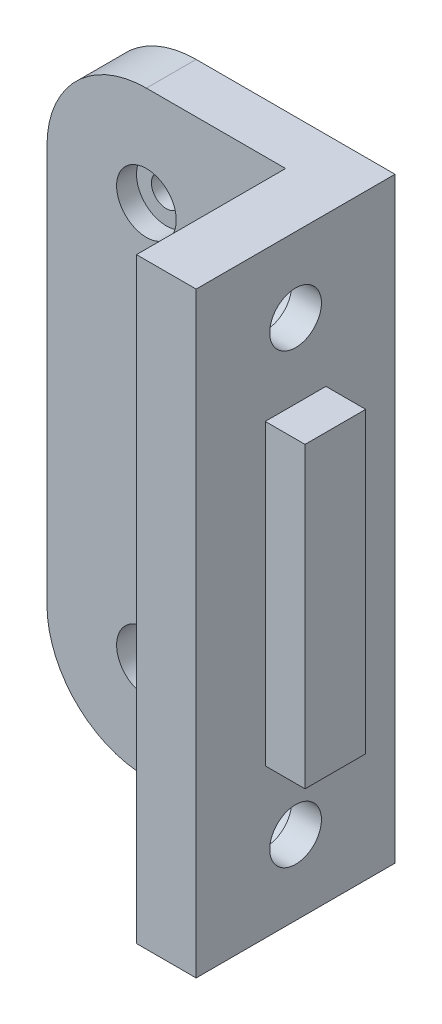
ISO-10303-21;
HEADER;
FILE_DESCRIPTION(('STEP AP214'),'2;1');
FILE_NAME('part.step','',(''),(''),'','','');
FILE_SCHEMA(('AUTOMOTIVE_DESIGN { 1 0 10303 214 1 1 1 1 }'));
ENDSEC;
DATA;
#1=APPLICATION_CONTEXT('core data for automotive mechanical design processes');
#2=APPLICATION_PROTOCOL_DEFINITION('international standard','automotive_design',2000,#1);
#3=PRODUCT_CONTEXT('',#1,'mechanical');
#4=PRODUCT('Part','Part','',(#3));
#5=PRODUCT_RELATED_PRODUCT_CATEGORY('part','',(#4));
#6=PRODUCT_DEFINITION_FORMATION('','',#4);
#7=PRODUCT_DEFINITION_CONTEXT('part definition',#1,'design');
#8=PRODUCT_DEFINITION('design','',#6,#7);
#9=PRODUCT_DEFINITION_SHAPE('','',#8);
#10=(LENGTH_UNIT() NAMED_UNIT(*) SI_UNIT(.MILLI.,.METRE.));
#11=(NAMED_UNIT(*) PLANE_ANGLE_UNIT() SI_UNIT($,.RADIAN.));
#12=(NAMED_UNIT(*) SI_UNIT($,.STERADIAN.) SOLID_ANGLE_UNIT());
#13=UNCERTAINTY_MEASURE_WITH_UNIT(LENGTH_MEASURE(1.E-05),#10,'distance_accuracy_value','');
#14=(GEOMETRIC_REPRESENTATION_CONTEXT(3) GLOBAL_UNCERTAINTY_ASSIGNED_CONTEXT((#13)) GLOBAL_UNIT_ASSIGNED_CONTEXT((#10,
#11,#12)) REPRESENTATION_CONTEXT('',''));
#15=CARTESIAN_POINT('',(0.,0.,0.));
#16=DIRECTION('',(0.,0.,1.));
#17=DIRECTION('',(1.,0.,0.));
#18=AXIS2_PLACEMENT_3D('',#15,#16,#17);
#19=CARTESIAN_POINT('',(0.,25.,0.));
#20=DIRECTION('',(0.,0.,1.));
#21=DIRECTION('',(1.,0.,0.));
#22=AXIS2_PLACEMENT_3D('',#19,#20,#21);
#23=CYLINDRICAL_SURFACE('',#22,1.5);
#24=CARTESIAN_POINT('',(0.,25.,0.));
#25=DIRECTION('',(0.,0.,1.));
#26=DIRECTION('',(1.,0.,0.));
#27=AXIS2_PLACEMENT_3D('',#24,#25,#26);
#28=CIRCLE('',#27,1.5);
#29=CARTESIAN_POINT('',(1.5,25.,0.));
#30=VERTEX_POINT('',#29);
#31=EDGE_CURVE('E232',#30,#30,#28,.T.);
#32=ORIENTED_EDGE('',*,*,#31,.F.);
#33=EDGE_LOOP('',(#32));
#34=FACE_BOUND('',#33,.T.);
#35=CARTESIAN_POINT('',(0.,25.,3.));
#36=DIRECTION('',(0.,0.,1.));
#37=DIRECTION('',(1.,0.,0.));
#38=AXIS2_PLACEMENT_3D('',#35,#36,#37);
#39=CIRCLE('',#38,1.5);
#40=CARTESIAN_POINT('',(1.5,25.,3.));
#41=VERTEX_POINT('',#40);
#42=EDGE_CURVE('E44',#41,#41,#39,.F.);
#43=ORIENTED_EDGE('',*,*,#42,.F.);
#44=EDGE_LOOP('',(#43));
#45=FACE_BOUND('',#44,.T.);
#46=ADVANCED_FACE('F40',(#34,#45),#23,.F.);
#47=CARTESIAN_POINT('',(10.,65.,0.));
#48=DIRECTION('',(0.,0.,1.));
#49=DIRECTION('',(1.,0.,0.));
#50=AXIS2_PLACEMENT_3D('',#47,#48,#49);
#51=CYLINDRICAL_SURFACE('',#50,1.5);
#52=CARTESIAN_POINT('',(10.,65.,0.));
#53=DIRECTION('',(0.,0.,1.));
#54=DIRECTION('',(1.,0.,0.));
#55=AXIS2_PLACEMENT_3D('',#52,#53,#54);
#56=CIRCLE('',#55,1.5);
#57=CARTESIAN_POINT('',(11.5,65.,0.));
#58=VERTEX_POINT('',#57);
#59=EDGE_CURVE('E223',#58,#58,#56,.T.);
#60=ORIENTED_EDGE('',*,*,#59,.F.);
#61=EDGE_LOOP('',(#60));
#62=FACE_BOUND('',#61,.T.);
#63=CARTESIAN_POINT('',(10.,65.,3.));
#64=DIRECTION('',(0.,0.,1.));
#65=DIRECTION('',(1.,0.,0.));
#66=AXIS2_PLACEMENT_3D('',#63,#64,#65);
#67=CIRCLE('',#66,1.5);
#68=CARTESIAN_POINT('',(11.5,65.,3.));
#69=VERTEX_POINT('',#68);
#70=EDGE_CURVE('E306',#69,#69,#67,.F.);
#71=ORIENTED_EDGE('',*,*,#70,.F.);
#72=EDGE_LOOP('',(#71));
#73=FACE_BOUND('',#72,.T.);
#74=ADVANCED_FACE('F354',(#62,#73),#51,.F.);
#75=CARTESIAN_POINT('',(0.,65.,0.));
#76=DIRECTION('',(0.,0.,1.));
#77=DIRECTION('',(1.,0.,0.));
#78=AXIS2_PLACEMENT_3D('',#75,#76,#77);
#79=CYLINDRICAL_SURFACE('',#78,1.5);
#80=CARTESIAN_POINT('',(0.,65.,0.));
#81=DIRECTION('',(0.,0.,1.));
#82=DIRECTION('',(1.,0.,0.));
#83=AXIS2_PLACEMENT_3D('',#80,#81,#82);
#84=CIRCLE('',#83,1.5);
#85=CARTESIAN_POINT('',(1.5,65.,0.));
#86=VERTEX_POINT('',#85);
#87=EDGE_CURVE('E227',#86,#86,#84,.T.);
#88=ORIENTED_EDGE('',*,*,#87,.F.);
#89=EDGE_LOOP('',(#88));
#90=FACE_BOUND('',#89,.T.);
#91=CARTESIAN_POINT('',(0.,65.,3.));
#92=DIRECTION('',(0.,0.,1.));
#93=DIRECTION('',(1.,0.,0.));
#94=AXIS2_PLACEMENT_3D('',#91,#92,#93);
#95=CIRCLE('',#94,1.5);
#96=CARTESIAN_POINT('',(1.5,65.,3.));
#97=VERTEX_POINT('',#96);
#98=EDGE_CURVE('E302',#97,#97,#95,.F.);
#99=ORIENTED_EDGE('',*,*,#98,.F.);
#100=EDGE_LOOP('',(#99));
#101=FACE_BOUND('',#100,.T.);
#102=ADVANCED_FACE('F347',(#90,#101),#79,.F.);
#103=CARTESIAN_POINT('',(10.,25.,0.));
#104=DIRECTION('',(0.,0.,1.));
#105=DIRECTION('',(1.,0.,0.));
#106=AXIS2_PLACEMENT_3D('',#103,#104,#105);
#107=CYLINDRICAL_SURFACE('',#106,1.5);
#108=CARTESIAN_POINT('',(10.,25.,0.));
#109=DIRECTION('',(0.,0.,1.));
#110=DIRECTION('',(1.,0.,0.));
#111=AXIS2_PLACEMENT_3D('',#108,#109,#110);
#112=CIRCLE('',#111,1.5);
#113=CARTESIAN_POINT('',(11.5,25.,0.));
#114=VERTEX_POINT('',#113);
#115=EDGE_CURVE('E228',#114,#114,#112,.T.);
#116=ORIENTED_EDGE('',*,*,#115,.F.);
#117=EDGE_LOOP('',(#116));
#118=FACE_BOUND('',#117,.T.);
#119=CARTESIAN_POINT('',(10.,25.,3.));
#120=DIRECTION('',(0.,0.,1.));
#121=DIRECTION('',(1.,0.,0.));
#122=AXIS2_PLACEMENT_3D('',#119,#120,#121);
#123=CIRCLE('',#122,1.5);
#124=CARTESIAN_POINT('',(11.5,25.,3.));
#125=VERTEX_POINT('',#124);
#126=EDGE_CURVE('E298',#125,#125,#123,.F.);
#127=ORIENTED_EDGE('',*,*,#126,.F.);
#128=EDGE_LOOP('',(#127));
#129=FACE_BOUND('',#128,.T.);
#130=ADVANCED_FACE('F338',(#118,#129),#107,.F.);
#131=CARTESIAN_POINT('',(20.,90.,0.));
#132=DIRECTION('',(-1.,0.,0.));
#133=DIRECTION('',(0.,0.,1.));
#134=AXIS2_PLACEMENT_3D('',#131,#132,#133);
#135=PLANE('',#134);
#136=DIRECTION('',(0.,-1.,0.));
#137=VECTOR('',#136,1.);
#138=CARTESIAN_POINT('',(20.,90.,0.));
#139=LINE('',#138,#137);
#140=CARTESIAN_POINT('',(20.,75.,0.));
#141=VERTEX_POINT('',#140);
#142=CARTESIAN_POINT('',(20.,15.,0.));
#143=VERTEX_POINT('',#142);
#144=EDGE_CURVE('E268',#141,#143,#139,.T.);
#145=ORIENTED_EDGE('',*,*,#144,.F.);
#146=DIRECTION('',(0.,0.,-1.));
#147=VECTOR('',#146,1.);
#148=CARTESIAN_POINT('',(20.,75.,40.));
#149=LINE('',#148,#147);
#150=CARTESIAN_POINT('',(20.,75.,20.));
#151=VERTEX_POINT('',#150);
#152=EDGE_CURVE('E194',#151,#141,#149,.T.);
#153=ORIENTED_EDGE('',*,*,#152,.F.);
#154=DIRECTION('',(0.,-1.,0.));
#155=VECTOR('',#154,1.);
#156=CARTESIAN_POINT('',(20.,90.,20.));
#157=LINE('',#156,#155);
#158=CARTESIAN_POINT('',(20.,15.,20.));
#159=VERTEX_POINT('',#158);
#160=EDGE_CURVE('E277',#151,#159,#157,.T.);
#161=ORIENTED_EDGE('',*,*,#160,.T.);
#162=DIRECTION('',(0.,0.,-1.));
#163=VECTOR('',#162,1.);
#164=CARTESIAN_POINT('',(20.,15.,40.));
#165=LINE('',#164,#163);
#166=EDGE_CURVE('E197',#159,#143,#165,.T.);
#167=ORIENTED_EDGE('',*,*,#166,.T.);
#168=EDGE_LOOP('',(#145,#153,#161,#167));
#169=FACE_BOUND('',#168,.T.);
#170=CARTESIAN_POINT('',(20.,22.5,10.));
#171=DIRECTION('',(1.,0.,0.));
#172=DIRECTION('',(0.,0.,-1.));
#173=AXIS2_PLACEMENT_3D('',#170,#171,#172);
#174=CIRCLE('',#173,2.6);
#175=CARTESIAN_POINT('',(20.,22.5,7.4));
#176=VERTEX_POINT('',#175);
#177=EDGE_CURVE('E260',#176,#176,#174,.T.);
#178=ORIENTED_EDGE('',*,*,#177,.F.);
#179=EDGE_LOOP('',(#178));
#180=FACE_BOUND('',#179,.T.);
#181=CARTESIAN_POINT('',(20.,67.5,10.));
#182=DIRECTION('',(1.,0.,0.));
#183=DIRECTION('',(0.,0.,-1.));
#184=AXIS2_PLACEMENT_3D('',#181,#182,#183);
#185=CIRCLE('',#184,2.6);
#186=CARTESIAN_POINT('',(20.,67.5,7.4));
#187=VERTEX_POINT('',#186);
#188=EDGE_CURVE('E255',#187,#187,#185,.T.);
#189=ORIENTED_EDGE('',*,*,#188,.F.);
#190=EDGE_LOOP('',(#189));
#191=FACE_BOUND('',#190,.T.);
#192=DIRECTION('',(0.,0.,-1.));
#193=VECTOR('',#192,1.);
#194=CARTESIAN_POINT('',(20.,30.,0.));
#195=LINE('',#194,#193);
#196=CARTESIAN_POINT('',(20.,30.,13.05));
#197=VERTEX_POINT('',#196);
#198=CARTESIAN_POINT('',(20.,30.,6.95));
#199=VERTEX_POINT('',#198);
#200=EDGE_CURVE('E162',#197,#199,#195,.T.);
#201=ORIENTED_EDGE('',*,*,#200,.F.);
#202=DIRECTION('',(0.,1.,0.));
#203=VECTOR('',#202,1.);
#204=CARTESIAN_POINT('',(20.,0.,13.05));
#205=LINE('',#204,#203);
#206=CARTESIAN_POINT('',(20.,60.,13.05));
#207=VERTEX_POINT('',#206);
#208=EDGE_CURVE('E158',#197,#207,#205,.T.);
#209=ORIENTED_EDGE('',*,*,#208,.T.);
#210=DIRECTION('',(0.,0.,-1.));
#211=VECTOR('',#210,1.);
#212=CARTESIAN_POINT('',(20.,60.,0.));
#213=LINE('',#212,#211);
#214=CARTESIAN_POINT('',(20.,60.,6.95));
#215=VERTEX_POINT('',#214);
#216=EDGE_CURVE('E58',#207,#215,#213,.T.);
#217=ORIENTED_EDGE('',*,*,#216,.T.);
#218=DIRECTION('',(0.,1.,0.));
#219=VECTOR('',#218,1.);
#220=CARTESIAN_POINT('',(20.,0.,6.95));
#221=LINE('',#220,#219);
#222=EDGE_CURVE('E316',#199,#215,#221,.T.);
#223=ORIENTED_EDGE('',*,*,#222,.F.);
#224=EDGE_LOOP('',(#201,#209,#217,#223));
#225=FACE_BOUND('',#224,.T.);
#226=ADVANCED_FACE('F335',(#169,#180,#191,#225),#135,.F.);
#227=CARTESIAN_POINT('',(5.,22.5,10.));
#228=DIRECTION('',(1.,0.,0.));
#229=DIRECTION('',(0.,0.,-1.));
#230=AXIS2_PLACEMENT_3D('',#227,#228,#229);
#231=CYLINDRICAL_SURFACE('',#230,2.6);
#232=ORIENTED_EDGE('',*,*,#177,.T.);
#233=EDGE_LOOP('',(#232));
#234=FACE_BOUND('',#233,.T.);
#235=CARTESIAN_POINT('',(17.,22.5,10.));
#236=DIRECTION('',(-1.,0.,0.));
#237=DIRECTION('',(0.,-1.,0.));
#238=AXIS2_PLACEMENT_3D('',#235,#236,#237);
#239=CIRCLE('',#238,2.6);
#240=CARTESIAN_POINT('',(17.,19.9,10.));
#241=VERTEX_POINT('',#240);
#242=EDGE_CURVE('E264',#241,#241,#239,.F.);
#243=ORIENTED_EDGE('',*,*,#242,.F.);
#244=EDGE_LOOP('',(#243));
#245=FACE_BOUND('',#244,.T.);
#246=ADVANCED_FACE('F337',(#234,#245),#231,.F.);
#247=CARTESIAN_POINT('',(5.,67.5,10.));
#248=DIRECTION('',(1.,0.,0.));
#249=DIRECTION('',(0.,0.,-1.));
#250=AXIS2_PLACEMENT_3D('',#247,#248,#249);
#251=CYLINDRICAL_SURFACE('',#250,2.6);
#252=ORIENTED_EDGE('',*,*,#188,.T.);
#253=EDGE_LOOP('',(#252));
#254=FACE_BOUND('',#253,.T.);
#255=CARTESIAN_POINT('',(17.,67.5,10.));
#256=DIRECTION('',(-1.,0.,0.));
#257=DIRECTION('',(0.,-1.,0.));
#258=AXIS2_PLACEMENT_3D('',#255,#256,#257);
#259=CIRCLE('',#258,2.6);
#260=CARTESIAN_POINT('',(17.,64.9,10.));
#261=VERTEX_POINT('',#260);
#262=EDGE_CURVE('E244',#261,#261,#259,.F.);
#263=ORIENTED_EDGE('',*,*,#262,.F.);
#264=EDGE_LOOP('',(#263));
#265=FACE_BOUND('',#264,.T.);
#266=ADVANCED_FACE('F344',(#254,#265),#251,.F.);
#267=CARTESIAN_POINT('',(0.,90.,20.));
#268=DIRECTION('',(0.,0.,-1.));
#269=DIRECTION('',(-1.,0.,0.));
#270=AXIS2_PLACEMENT_3D('',#267,#268,#269);
#271=PLANE('',#270);
#272=ORIENTED_EDGE('',*,*,#160,.F.);
#273=DIRECTION('',(-1.,0.,0.));
#274=VECTOR('',#273,1.);
#275=CARTESIAN_POINT('',(0.,75.,20.));
#276=LINE('',#275,#274);
#277=CARTESIAN_POINT('',(14.,75.,20.));
#278=VERTEX_POINT('',#277);
#279=EDGE_CURVE('E219',#151,#278,#276,.T.);
#280=ORIENTED_EDGE('',*,*,#279,.T.);
#281=DIRECTION('',(0.,1.,0.));
#282=VECTOR('',#281,1.);
#283=CARTESIAN_POINT('',(14.,90.,20.));
#284=LINE('',#283,#282);
#285=CARTESIAN_POINT('',(14.,15.,20.));
#286=VERTEX_POINT('',#285);
#287=EDGE_CURVE('E259',#286,#278,#284,.T.);
#288=ORIENTED_EDGE('',*,*,#287,.F.);
#289=DIRECTION('',(1.,0.,0.));
#290=VECTOR('',#289,1.);
#291=CARTESIAN_POINT('',(0.,15.,20.));
#292=LINE('',#291,#290);
#293=EDGE_CURVE('E211',#286,#159,#292,.T.);
#294=ORIENTED_EDGE('',*,*,#293,.T.);
#295=EDGE_LOOP('',(#272,#280,#288,#294));
#296=FACE_BOUND('',#295,.T.);
#297=ADVANCED_FACE('F42',(#296),#271,.F.);
#298=CARTESIAN_POINT('',(0.,90.,0.));
#299=DIRECTION('',(0.,0.,1.));
#300=DIRECTION('',(1.,0.,0.));
#301=AXIS2_PLACEMENT_3D('',#298,#299,#300);
#302=PLANE('',#301);
#303=ORIENTED_EDGE('',*,*,#115,.T.);
#304=EDGE_LOOP('',(#303));
#305=FACE_BOUND('',#304,.T.);
#306=ORIENTED_EDGE('',*,*,#87,.T.);
#307=EDGE_LOOP('',(#306));
#308=FACE_BOUND('',#307,.T.);
#309=ORIENTED_EDGE('',*,*,#59,.T.);
#310=EDGE_LOOP('',(#309));
#311=FACE_BOUND('',#310,.T.);
#312=ORIENTED_EDGE('',*,*,#31,.T.);
#313=EDGE_LOOP('',(#312));
#314=FACE_BOUND('',#313,.T.);
#315=CARTESIAN_POINT('',(0.,65.,0.));
#316=DIRECTION('',(0.,0.,1.));
#317=DIRECTION('',(1.,0.,0.));
#318=AXIS2_PLACEMENT_3D('',#315,#316,#317);
#319=CIRCLE('',#318,10.);
#320=CARTESIAN_POINT('',(0.,75.,0.));
#321=VERTEX_POINT('',#320);
#322=CARTESIAN_POINT('',(-10.,65.,0.));
#323=VERTEX_POINT('',#322);
#324=EDGE_CURVE('E165',#321,#323,#319,.T.);
#325=ORIENTED_EDGE('',*,*,#324,.F.);
#326=DIRECTION('',(-1.,0.,0.));
#327=VECTOR('',#326,1.);
#328=CARTESIAN_POINT('',(20.,75.,0.));
#329=LINE('',#328,#327);
#330=EDGE_CURVE('E185',#141,#321,#329,.T.);
#331=ORIENTED_EDGE('',*,*,#330,.F.);
#332=ORIENTED_EDGE('',*,*,#144,.T.);
#333=DIRECTION('',(1.,0.,0.));
#334=VECTOR('',#333,1.);
#335=CARTESIAN_POINT('',(0.,15.,0.));
#336=LINE('',#335,#334);
#337=CARTESIAN_POINT('',(0.,15.,0.));
#338=VERTEX_POINT('',#337);
#339=EDGE_CURVE('E182',#338,#143,#336,.T.);
#340=ORIENTED_EDGE('',*,*,#339,.F.);
#341=CARTESIAN_POINT('',(0.,25.,0.));
#342=DIRECTION('',(0.,0.,1.));
#343=DIRECTION('',(-1.,0.,0.));
#344=AXIS2_PLACEMENT_3D('',#341,#342,#343);
#345=CIRCLE('',#344,10.);
#346=CARTESIAN_POINT('',(-10.,25.,0.));
#347=VERTEX_POINT('',#346);
#348=EDGE_CURVE('E178',#347,#338,#345,.T.);
#349=ORIENTED_EDGE('',*,*,#348,.F.);
#350=DIRECTION('',(0.,-1.,0.));
#351=VECTOR('',#350,1.);
#352=CARTESIAN_POINT('',(-10.,65.,0.));
#353=LINE('',#352,#351);
#354=EDGE_CURVE('E170',#323,#347,#353,.T.);
#355=ORIENTED_EDGE('',*,*,#354,.F.);
#356=EDGE_LOOP('',(#325,#331,#332,#340,#349,#355));
#357=FACE_BOUND('',#356,.T.);
#358=ADVANCED_FACE('F392',(#305,#308,#311,#314,#357),#302,.F.);
#359=CARTESIAN_POINT('',(14.,90.,5.));
#360=DIRECTION('',(1.,0.,0.));
#361=DIRECTION('',(0.,1.,0.));
#362=AXIS2_PLACEMENT_3D('',#359,#360,#361);
#363=PLANE('',#362);
#364=ORIENTED_EDGE('',*,*,#287,.T.);
#365=DIRECTION('',(0.,0.,-1.));
#366=VECTOR('',#365,1.);
#367=CARTESIAN_POINT('',(14.,75.,5.));
#368=LINE('',#367,#366);
#369=CARTESIAN_POINT('',(14.,75.,5.));
#370=VERTEX_POINT('',#369);
#371=EDGE_CURVE('E215',#278,#370,#368,.T.);
#372=ORIENTED_EDGE('',*,*,#371,.T.);
#373=DIRECTION('',(0.,1.,0.));
#374=VECTOR('',#373,1.);
#375=CARTESIAN_POINT('',(14.,90.,5.));
#376=LINE('',#375,#374);
#377=CARTESIAN_POINT('',(14.,67.5,5.));
#378=VERTEX_POINT('',#377);
#379=EDGE_CURVE('E270',#378,#370,#376,.T.);
#380=ORIENTED_EDGE('',*,*,#379,.F.);
#381=CARTESIAN_POINT('',(14.,67.5,10.));
#382=DIRECTION('',(-1.,0.,0.));
#383=DIRECTION('',(0.,-1.,0.));
#384=AXIS2_PLACEMENT_3D('',#381,#382,#383);
#385=CIRCLE('',#384,5.);
#386=EDGE_CURVE('E245',#378,#378,#385,.T.);
#387=ORIENTED_EDGE('',*,*,#386,.F.);
#388=CARTESIAN_POINT('',(14.,22.5,5.));
#389=VERTEX_POINT('',#388);
#390=EDGE_CURVE('E269',#389,#378,#376,.T.);
#391=ORIENTED_EDGE('',*,*,#390,.F.);
#392=CARTESIAN_POINT('',(14.,22.5,10.));
#393=DIRECTION('',(-1.,0.,0.));
#394=DIRECTION('',(0.,-1.,0.));
#395=AXIS2_PLACEMENT_3D('',#392,#393,#394);
#396=CIRCLE('',#395,5.);
#397=EDGE_CURVE('E239',#389,#389,#396,.T.);
#398=ORIENTED_EDGE('',*,*,#397,.F.);
#399=CARTESIAN_POINT('',(14.,15.,5.));
#400=VERTEX_POINT('',#399);
#401=EDGE_CURVE('E265',#400,#389,#376,.T.);
#402=ORIENTED_EDGE('',*,*,#401,.F.);
#403=DIRECTION('',(0.,0.,1.));
#404=VECTOR('',#403,1.);
#405=CARTESIAN_POINT('',(14.,15.,5.));
#406=LINE('',#405,#404);
#407=EDGE_CURVE('E193',#400,#286,#406,.T.);
#408=ORIENTED_EDGE('',*,*,#407,.T.);
#409=EDGE_LOOP('',(#364,#372,#380,#387,#391,#398,#402,#408));
#410=FACE_BOUND('',#409,.T.);
#411=ADVANCED_FACE('F389',(#410),#363,.F.);
#412=CARTESIAN_POINT('',(0.,0.,5.));
#413=DIRECTION('',(0.,0.,1.));
#414=DIRECTION('',(1.,0.,0.));
#415=AXIS2_PLACEMENT_3D('',#412,#413,#414);
#416=PLANE('',#415);
#417=CARTESIAN_POINT('',(10.,65.,5.));
#418=DIRECTION('',(0.,0.,1.));
#419=DIRECTION('',(1.,0.,0.));
#420=AXIS2_PLACEMENT_3D('',#417,#418,#419);
#421=CIRCLE('',#420,3.);
#422=CARTESIAN_POINT('',(13.,65.,5.));
#423=VERTEX_POINT('',#422);
#424=EDGE_CURVE('E527',#423,#423,#421,.T.);
#425=ORIENTED_EDGE('',*,*,#424,.F.);
#426=EDGE_LOOP('',(#425));
#427=FACE_BOUND('',#426,.T.);
#428=CARTESIAN_POINT('',(0.,25.,5.));
#429=DIRECTION('',(0.,0.,1.));
#430=DIRECTION('',(1.,0.,0.));
#431=AXIS2_PLACEMENT_3D('',#428,#429,#430);
#432=CIRCLE('',#431,3.);
#433=CARTESIAN_POINT('',(3.,25.,5.));
#434=VERTEX_POINT('',#433);
#435=EDGE_CURVE('E511',#434,#434,#432,.T.);
#436=ORIENTED_EDGE('',*,*,#435,.F.);
#437=EDGE_LOOP('',(#436));
#438=FACE_BOUND('',#437,.T.);
#439=CARTESIAN_POINT('',(10.,25.,5.));
#440=DIRECTION('',(0.,0.,1.));
#441=DIRECTION('',(1.,0.,0.));
#442=AXIS2_PLACEMENT_3D('',#439,#440,#441);
#443=CIRCLE('',#442,3.);
#444=CARTESIAN_POINT('',(13.,25.,5.));
#445=VERTEX_POINT('',#444);
#446=EDGE_CURVE('E512',#445,#445,#443,.T.);
#447=ORIENTED_EDGE('',*,*,#446,.F.);
#448=EDGE_LOOP('',(#447));
#449=FACE_BOUND('',#448,.T.);
#450=CARTESIAN_POINT('',(0.,65.,5.));
#451=DIRECTION('',(0.,0.,1.));
#452=DIRECTION('',(1.,0.,0.));
#453=AXIS2_PLACEMENT_3D('',#450,#451,#452);
#454=CIRCLE('',#453,3.);
#455=CARTESIAN_POINT('',(3.,65.,5.));
#456=VERTEX_POINT('',#455);
#457=EDGE_CURVE('E526',#456,#456,#454,.T.);
#458=ORIENTED_EDGE('',*,*,#457,.F.);
#459=EDGE_LOOP('',(#458));
#460=FACE_BOUND('',#459,.T.);
#461=DIRECTION('',(1.,0.,0.));
#462=VECTOR('',#461,1.);
#463=CARTESIAN_POINT('',(0.,75.,5.));
#464=LINE('',#463,#462);
#465=CARTESIAN_POINT('',(0.,75.,5.));
#466=VERTEX_POINT('',#465);
#467=EDGE_CURVE('E11',#466,#370,#464,.T.);
#468=ORIENTED_EDGE('',*,*,#467,.F.);
#469=CARTESIAN_POINT('',(0.,65.,5.));
#470=DIRECTION('',(0.,0.,1.));
#471=DIRECTION('',(1.,0.,0.));
#472=AXIS2_PLACEMENT_3D('',#469,#470,#471);
#473=CIRCLE('',#472,10.);
#474=CARTESIAN_POINT('',(-10.,65.,5.));
#475=VERTEX_POINT('',#474);
#476=EDGE_CURVE('E50',#475,#466,#473,.F.);
#477=ORIENTED_EDGE('',*,*,#476,.F.);
#478=DIRECTION('',(0.,1.,0.));
#479=VECTOR('',#478,1.);
#480=CARTESIAN_POINT('',(-9.99999999999999,0.,5.));
#481=LINE('',#480,#479);
#482=CARTESIAN_POINT('',(-10.,25.,5.));
#483=VERTEX_POINT('',#482);
#484=EDGE_CURVE('E281',#483,#475,#481,.T.);
#485=ORIENTED_EDGE('',*,*,#484,.F.);
#486=CARTESIAN_POINT('',(0.,25.,5.));
#487=DIRECTION('',(0.,0.,1.));
#488=DIRECTION('',(1.,0.,0.));
#489=AXIS2_PLACEMENT_3D('',#486,#487,#488);
#490=CIRCLE('',#489,10.);
#491=CARTESIAN_POINT('',(0.,15.,5.));
#492=VERTEX_POINT('',#491);
#493=EDGE_CURVE('E290',#492,#483,#490,.F.);
#494=ORIENTED_EDGE('',*,*,#493,.F.);
#495=DIRECTION('',(-1.,0.,0.));
#496=VECTOR('',#495,1.);
#497=CARTESIAN_POINT('',(0.,15.,5.));
#498=LINE('',#497,#496);
#499=EDGE_CURVE('E293',#400,#492,#498,.T.);
#500=ORIENTED_EDGE('',*,*,#499,.F.);
#501=ORIENTED_EDGE('',*,*,#401,.T.);
#502=ORIENTED_EDGE('',*,*,#390,.T.);
#503=ORIENTED_EDGE('',*,*,#379,.T.);
#504=EDGE_LOOP('',(#468,#477,#485,#494,#500,#501,#502,#503));
#505=FACE_BOUND('',#504,.T.);
#506=ADVANCED_FACE('F370',(#427,#438,#449,#460,#505),#416,.T.);
#507=CARTESIAN_POINT('',(17.,67.5,10.));
#508=DIRECTION('',(-1.,0.,0.));
#509=DIRECTION('',(0.,-1.,0.));
#510=AXIS2_PLACEMENT_3D('',#507,#508,#509);
#511=PLANE('',#510);
#512=CARTESIAN_POINT('',(17.,67.5,10.));
#513=DIRECTION('',(-1.,0.,0.));
#514=DIRECTION('',(0.,-1.,0.));
#515=AXIS2_PLACEMENT_3D('',#512,#513,#514);
#516=CIRCLE('',#515,5.);
#517=CARTESIAN_POINT('',(17.,62.5,10.));
#518=VERTEX_POINT('',#517);
#519=EDGE_CURVE('E240',#518,#518,#516,.T.);
#520=ORIENTED_EDGE('',*,*,#519,.T.);
#521=EDGE_LOOP('',(#520));
#522=FACE_BOUND('',#521,.T.);
#523=ORIENTED_EDGE('',*,*,#262,.T.);
#524=EDGE_LOOP('',(#523));
#525=FACE_BOUND('',#524,.T.);
#526=ADVANCED_FACE('F366',(#522,#525),#511,.T.);
#527=CARTESIAN_POINT('',(17.,67.5,10.));
#528=DIRECTION('',(-1.,0.,0.));
#529=DIRECTION('',(0.,-1.,0.));
#530=AXIS2_PLACEMENT_3D('',#527,#528,#529);
#531=CYLINDRICAL_SURFACE('',#530,5.);
#532=ORIENTED_EDGE('',*,*,#519,.F.);
#533=EDGE_LOOP('',(#532));
#534=FACE_BOUND('',#533,.T.);
#535=ORIENTED_EDGE('',*,*,#386,.T.);
#536=EDGE_LOOP('',(#535));
#537=FACE_BOUND('',#536,.T.);
#538=ADVANCED_FACE('F369',(#534,#537),#531,.F.);
#539=CARTESIAN_POINT('',(17.,22.5,10.));
#540=DIRECTION('',(-1.,0.,0.));
#541=DIRECTION('',(0.,-1.,0.));
#542=AXIS2_PLACEMENT_3D('',#539,#540,#541);
#543=PLANE('',#542);
#544=CARTESIAN_POINT('',(17.,22.5,10.));
#545=DIRECTION('',(-1.,0.,0.));
#546=DIRECTION('',(0.,-1.,0.));
#547=AXIS2_PLACEMENT_3D('',#544,#545,#546);
#548=CIRCLE('',#547,5.);
#549=CARTESIAN_POINT('',(17.,17.5,10.));
#550=VERTEX_POINT('',#549);
#551=EDGE_CURVE('E248',#550,#550,#548,.T.);
#552=ORIENTED_EDGE('',*,*,#551,.T.);
#553=EDGE_LOOP('',(#552));
#554=FACE_BOUND('',#553,.T.);
#555=ORIENTED_EDGE('',*,*,#242,.T.);
#556=EDGE_LOOP('',(#555));
#557=FACE_BOUND('',#556,.T.);
#558=ADVANCED_FACE('F374',(#554,#557),#543,.T.);
#559=CARTESIAN_POINT('',(17.,22.5,10.));
#560=DIRECTION('',(-1.,0.,0.));
#561=DIRECTION('',(0.,-1.,0.));
#562=AXIS2_PLACEMENT_3D('',#559,#560,#561);
#563=CYLINDRICAL_SURFACE('',#562,5.);
#564=ORIENTED_EDGE('',*,*,#551,.F.);
#565=EDGE_LOOP('',(#564));
#566=FACE_BOUND('',#565,.T.);
#567=ORIENTED_EDGE('',*,*,#397,.T.);
#568=EDGE_LOOP('',(#567));
#569=FACE_BOUND('',#568,.T.);
#570=ADVANCED_FACE('F378',(#566,#569),#563,.F.);
#571=CARTESIAN_POINT('',(20.,75.,40.));
#572=DIRECTION('',(0.,-1.,0.));
#573=DIRECTION('',(0.,0.,-1.));
#574=AXIS2_PLACEMENT_3D('',#571,#572,#573);
#575=PLANE('',#574);
#576=ORIENTED_EDGE('',*,*,#152,.T.);
#577=ORIENTED_EDGE('',*,*,#330,.T.);
#578=DIRECTION('',(0.,0.,-1.));
#579=VECTOR('',#578,1.);
#580=CARTESIAN_POINT('',(0.,75.,40.));
#581=LINE('',#580,#579);
#582=EDGE_CURVE('E190',#466,#321,#581,.T.);
#583=ORIENTED_EDGE('',*,*,#582,.F.);
#584=ORIENTED_EDGE('',*,*,#467,.T.);
#585=ORIENTED_EDGE('',*,*,#371,.F.);
#586=ORIENTED_EDGE('',*,*,#279,.F.);
#587=EDGE_LOOP('',(#576,#577,#583,#584,#585,#586));
#588=FACE_BOUND('',#587,.T.);
#589=ADVANCED_FACE('F382',(#588),#575,.F.);
#590=CARTESIAN_POINT('',(0.,15.,40.));
#591=DIRECTION('',(0.,1.,0.));
#592=DIRECTION('',(-1.,0.,0.));
#593=AXIS2_PLACEMENT_3D('',#590,#591,#592);
#594=PLANE('',#593);
#595=ORIENTED_EDGE('',*,*,#407,.F.);
#596=ORIENTED_EDGE('',*,*,#499,.T.);
#597=DIRECTION('',(0.,0.,-1.));
#598=VECTOR('',#597,1.);
#599=CARTESIAN_POINT('',(0.,15.,40.));
#600=LINE('',#599,#598);
#601=EDGE_CURVE('E201',#492,#338,#600,.T.);
#602=ORIENTED_EDGE('',*,*,#601,.T.);
#603=ORIENTED_EDGE('',*,*,#339,.T.);
#604=ORIENTED_EDGE('',*,*,#166,.F.);
#605=ORIENTED_EDGE('',*,*,#293,.F.);
#606=EDGE_LOOP('',(#595,#596,#602,#603,#604,#605));
#607=FACE_BOUND('',#606,.T.);
#608=ADVANCED_FACE('F422',(#607),#594,.F.);
#609=CARTESIAN_POINT('',(0.,65.,40.));
#610=DIRECTION('',(0.,0.,-1.));
#611=DIRECTION('',(-1.,0.,0.));
#612=AXIS2_PLACEMENT_3D('',#609,#610,#611);
#613=CYLINDRICAL_SURFACE('',#612,10.);
#614=ORIENTED_EDGE('',*,*,#476,.T.);
#615=ORIENTED_EDGE('',*,*,#582,.T.);
#616=ORIENTED_EDGE('',*,*,#324,.T.);
#617=DIRECTION('',(0.,0.,-1.));
#618=VECTOR('',#617,1.);
#619=CARTESIAN_POINT('',(-10.,65.,40.));
#620=LINE('',#619,#618);
#621=EDGE_CURVE('E189',#475,#323,#620,.T.);
#622=ORIENTED_EDGE('',*,*,#621,.F.);
#623=EDGE_LOOP('',(#614,#615,#616,#622));
#624=FACE_BOUND('',#623,.T.);
#625=ADVANCED_FACE('F413',(#624),#613,.T.);
#626=CARTESIAN_POINT('',(0.,25.,40.));
#627=DIRECTION('',(0.,0.,-1.));
#628=DIRECTION('',(-1.,0.,0.));
#629=AXIS2_PLACEMENT_3D('',#626,#627,#628);
#630=CYLINDRICAL_SURFACE('',#629,10.);
#631=ORIENTED_EDGE('',*,*,#493,.T.);
#632=DIRECTION('',(0.,0.,-1.));
#633=VECTOR('',#632,1.);
#634=CARTESIAN_POINT('',(-10.,25.,40.));
#635=LINE('',#634,#633);
#636=EDGE_CURVE('E66',#483,#347,#635,.T.);
#637=ORIENTED_EDGE('',*,*,#636,.T.);
#638=ORIENTED_EDGE('',*,*,#348,.T.);
#639=ORIENTED_EDGE('',*,*,#601,.F.);
#640=EDGE_LOOP('',(#631,#637,#638,#639));
#641=FACE_BOUND('',#640,.T.);
#642=ADVANCED_FACE('F435',(#641),#630,.T.);
#643=CARTESIAN_POINT('',(-10.,65.,40.));
#644=DIRECTION('',(1.,0.,0.));
#645=DIRECTION('',(0.,1.,0.));
#646=AXIS2_PLACEMENT_3D('',#643,#644,#645);
#647=PLANE('',#646);
#648=ORIENTED_EDGE('',*,*,#484,.T.);
#649=ORIENTED_EDGE('',*,*,#621,.T.);
#650=ORIENTED_EDGE('',*,*,#354,.T.);
#651=ORIENTED_EDGE('',*,*,#636,.F.);
#652=EDGE_LOOP('',(#648,#649,#650,#651));
#653=FACE_BOUND('',#652,.T.);
#654=ADVANCED_FACE('F437',(#653),#647,.F.);
#655=CARTESIAN_POINT('',(24.,30.,0.));
#656=DIRECTION('',(0.,1.,0.));
#657=DIRECTION('',(0.,0.,1.));
#658=AXIS2_PLACEMENT_3D('',#655,#656,#657);
#659=PLANE('',#658);
#660=ORIENTED_EDGE('',*,*,#200,.T.);
#661=DIRECTION('',(-1.,0.,0.));
#662=VECTOR('',#661,1.);
#663=CARTESIAN_POINT('',(24.,30.,6.95));
#664=LINE('',#663,#662);
#665=CARTESIAN_POINT('',(24.,30.,6.95));
#666=VERTEX_POINT('',#665);
#667=EDGE_CURVE('E141',#666,#199,#664,.T.);
#668=ORIENTED_EDGE('',*,*,#667,.F.);
#669=DIRECTION('',(0.,0.,-1.));
#670=VECTOR('',#669,1.);
#671=CARTESIAN_POINT('',(24.,30.,0.));
#672=LINE('',#671,#670);
#673=CARTESIAN_POINT('',(24.,30.,13.05));
#674=VERTEX_POINT('',#673);
#675=EDGE_CURVE('E149',#674,#666,#672,.T.);
#676=ORIENTED_EDGE('',*,*,#675,.F.);
#677=DIRECTION('',(-1.,0.,0.));
#678=VECTOR('',#677,1.);
#679=CARTESIAN_POINT('',(24.,30.,13.05));
#680=LINE('',#679,#678);
#681=EDGE_CURVE('E328',#674,#197,#680,.T.);
#682=ORIENTED_EDGE('',*,*,#681,.T.);
#683=EDGE_LOOP('',(#660,#668,#676,#682));
#684=FACE_BOUND('',#683,.T.);
#685=ADVANCED_FACE('F160',(#684),#659,.F.);
#686=CARTESIAN_POINT('',(24.,0.,6.95));
#687=DIRECTION('',(0.,0.,1.));
#688=DIRECTION('',(1.,0.,0.));
#689=AXIS2_PLACEMENT_3D('',#686,#687,#688);
#690=PLANE('',#689);
#691=ORIENTED_EDGE('',*,*,#222,.T.);
#692=DIRECTION('',(-1.,0.,0.));
#693=VECTOR('',#692,1.);
#694=CARTESIAN_POINT('',(24.,60.,6.95));
#695=LINE('',#694,#693);
#696=CARTESIAN_POINT('',(24.,60.,6.95));
#697=VERTEX_POINT('',#696);
#698=EDGE_CURVE('E143',#697,#215,#695,.T.);
#699=ORIENTED_EDGE('',*,*,#698,.F.);
#700=DIRECTION('',(0.,1.,0.));
#701=VECTOR('',#700,1.);
#702=CARTESIAN_POINT('',(24.,0.,6.95));
#703=LINE('',#702,#701);
#704=EDGE_CURVE('E136',#666,#697,#703,.T.);
#705=ORIENTED_EDGE('',*,*,#704,.F.);
#706=ORIENTED_EDGE('',*,*,#667,.T.);
#707=EDGE_LOOP('',(#691,#699,#705,#706));
#708=FACE_BOUND('',#707,.T.);
#709=ADVANCED_FACE('F139',(#708),#690,.F.);
#710=CARTESIAN_POINT('',(24.,60.,0.));
#711=DIRECTION('',(0.,1.,0.));
#712=DIRECTION('',(0.,0.,1.));
#713=AXIS2_PLACEMENT_3D('',#710,#711,#712);
#714=PLANE('',#713);
#715=ORIENTED_EDGE('',*,*,#216,.F.);
#716=DIRECTION('',(-1.,0.,0.));
#717=VECTOR('',#716,1.);
#718=CARTESIAN_POINT('',(24.,60.,13.05));
#719=LINE('',#718,#717);
#720=CARTESIAN_POINT('',(24.,60.,13.05));
#721=VERTEX_POINT('',#720);
#722=EDGE_CURVE('E172',#721,#207,#719,.T.);
#723=ORIENTED_EDGE('',*,*,#722,.F.);
#724=DIRECTION('',(0.,0.,-1.));
#725=VECTOR('',#724,1.);
#726=CARTESIAN_POINT('',(24.,60.,0.));
#727=LINE('',#726,#725);
#728=EDGE_CURVE('E148',#721,#697,#727,.T.);
#729=ORIENTED_EDGE('',*,*,#728,.T.);
#730=ORIENTED_EDGE('',*,*,#698,.T.);
#731=EDGE_LOOP('',(#715,#723,#729,#730));
#732=FACE_BOUND('',#731,.T.);
#733=ADVANCED_FACE('F464',(#732),#714,.T.);
#734=CARTESIAN_POINT('',(24.,0.,13.05));
#735=DIRECTION('',(0.,0.,1.));
#736=DIRECTION('',(1.,0.,0.));
#737=AXIS2_PLACEMENT_3D('',#734,#735,#736);
#738=PLANE('',#737);
#739=ORIENTED_EDGE('',*,*,#208,.F.);
#740=ORIENTED_EDGE('',*,*,#681,.F.);
#741=DIRECTION('',(0.,1.,0.));
#742=VECTOR('',#741,1.);
#743=CARTESIAN_POINT('',(24.,0.,13.05));
#744=LINE('',#743,#742);
#745=EDGE_CURVE('E155',#674,#721,#744,.T.);
#746=ORIENTED_EDGE('',*,*,#745,.T.);
#747=ORIENTED_EDGE('',*,*,#722,.T.);
#748=EDGE_LOOP('',(#739,#740,#746,#747));
#749=FACE_BOUND('',#748,.T.);
#750=ADVANCED_FACE('F333',(#749),#738,.T.);
#751=CARTESIAN_POINT('',(24.,0.,0.));
#752=DIRECTION('',(1.,0.,0.));
#753=DIRECTION('',(0.,0.,-1.));
#754=AXIS2_PLACEMENT_3D('',#751,#752,#753);
#755=PLANE('',#754);
#756=ORIENTED_EDGE('',*,*,#675,.T.);
#757=ORIENTED_EDGE('',*,*,#704,.T.);
#758=ORIENTED_EDGE('',*,*,#728,.F.);
#759=ORIENTED_EDGE('',*,*,#745,.F.);
#760=EDGE_LOOP('',(#756,#757,#758,#759));
#761=FACE_BOUND('',#760,.T.);
#762=ADVANCED_FACE('F153',(#761),#755,.T.);
#763=CARTESIAN_POINT('',(10.,25.,3.));
#764=DIRECTION('',(0.,0.,1.));
#765=DIRECTION('',(1.,0.,0.));
#766=AXIS2_PLACEMENT_3D('',#763,#764,#765);
#767=PLANE('',#766);
#768=CARTESIAN_POINT('',(10.,25.,3.));
#769=DIRECTION('',(0.,0.,1.));
#770=DIRECTION('',(1.,0.,0.));
#771=AXIS2_PLACEMENT_3D('',#768,#769,#770);
#772=CIRCLE('',#771,3.);
#773=CARTESIAN_POINT('',(13.,25.,3.));
#774=VERTEX_POINT('',#773);
#775=EDGE_CURVE('E507',#774,#774,#772,.T.);
#776=ORIENTED_EDGE('',*,*,#775,.T.);
#777=EDGE_LOOP('',(#776));
#778=FACE_BOUND('',#777,.T.);
#779=ORIENTED_EDGE('',*,*,#126,.T.);
#780=EDGE_LOOP('',(#779));
#781=FACE_BOUND('',#780,.T.);
#782=ADVANCED_FACE('F471',(#778,#781),#767,.T.);
#783=CARTESIAN_POINT('',(10.,25.,3.));
#784=DIRECTION('',(0.,0.,1.));
#785=DIRECTION('',(1.,0.,0.));
#786=AXIS2_PLACEMENT_3D('',#783,#784,#785);
#787=CYLINDRICAL_SURFACE('',#786,3.);
#788=ORIENTED_EDGE('',*,*,#775,.F.);
#789=EDGE_LOOP('',(#788));
#790=FACE_BOUND('',#789,.T.);
#791=ORIENTED_EDGE('',*,*,#446,.T.);
#792=EDGE_LOOP('',(#791));
#793=FACE_BOUND('',#792,.T.);
#794=ADVANCED_FACE('F480',(#790,#793),#787,.F.);
#795=CARTESIAN_POINT('',(0.,65.,3.));
#796=DIRECTION('',(0.,0.,1.));
#797=DIRECTION('',(1.,0.,0.));
#798=AXIS2_PLACEMENT_3D('',#795,#796,#797);
#799=PLANE('',#798);
#800=CARTESIAN_POINT('',(0.,65.,3.));
#801=DIRECTION('',(0.,0.,1.));
#802=DIRECTION('',(1.,0.,0.));
#803=AXIS2_PLACEMENT_3D('',#800,#801,#802);
#804=CIRCLE('',#803,3.);
#805=CARTESIAN_POINT('',(3.,65.,3.));
#806=VERTEX_POINT('',#805);
#807=EDGE_CURVE('E303',#806,#806,#804,.T.);
#808=ORIENTED_EDGE('',*,*,#807,.T.);
#809=EDGE_LOOP('',(#808));
#810=FACE_BOUND('',#809,.T.);
#811=ORIENTED_EDGE('',*,*,#98,.T.);
#812=EDGE_LOOP('',(#811));
#813=FACE_BOUND('',#812,.T.);
#814=ADVANCED_FACE('F476',(#810,#813),#799,.T.);
#815=CARTESIAN_POINT('',(0.,65.,3.));
#816=DIRECTION('',(0.,0.,1.));
#817=DIRECTION('',(1.,0.,0.));
#818=AXIS2_PLACEMENT_3D('',#815,#816,#817);
#819=CYLINDRICAL_SURFACE('',#818,3.);
#820=ORIENTED_EDGE('',*,*,#807,.F.);
#821=EDGE_LOOP('',(#820));
#822=FACE_BOUND('',#821,.T.);
#823=ORIENTED_EDGE('',*,*,#457,.T.);
#824=EDGE_LOOP('',(#823));
#825=FACE_BOUND('',#824,.T.);
#826=ADVANCED_FACE('F472',(#822,#825),#819,.F.);
#827=CARTESIAN_POINT('',(10.,65.,3.));
#828=DIRECTION('',(0.,0.,1.));
#829=DIRECTION('',(1.,0.,0.));
#830=AXIS2_PLACEMENT_3D('',#827,#828,#829);
#831=PLANE('',#830);
#832=CARTESIAN_POINT('',(10.,65.,3.));
#833=DIRECTION('',(0.,0.,1.));
#834=DIRECTION('',(1.,0.,0.));
#835=AXIS2_PLACEMENT_3D('',#832,#833,#834);
#836=CIRCLE('',#835,3.);
#837=CARTESIAN_POINT('',(13.,65.,3.));
#838=VERTEX_POINT('',#837);
#839=EDGE_CURVE('E522',#838,#838,#836,.T.);
#840=ORIENTED_EDGE('',*,*,#839,.T.);
#841=EDGE_LOOP('',(#840));
#842=FACE_BOUND('',#841,.T.);
#843=ORIENTED_EDGE('',*,*,#70,.T.);
#844=EDGE_LOOP('',(#843));
#845=FACE_BOUND('',#844,.T.);
#846=ADVANCED_FACE('F475',(#842,#845),#831,.T.);
#847=CARTESIAN_POINT('',(10.,65.,3.));
#848=DIRECTION('',(0.,0.,1.));
#849=DIRECTION('',(1.,0.,0.));
#850=AXIS2_PLACEMENT_3D('',#847,#848,#849);
#851=CYLINDRICAL_SURFACE('',#850,3.);
#852=ORIENTED_EDGE('',*,*,#839,.F.);
#853=EDGE_LOOP('',(#852));
#854=FACE_BOUND('',#853,.T.);
#855=ORIENTED_EDGE('',*,*,#424,.T.);
#856=EDGE_LOOP('',(#855));
#857=FACE_BOUND('',#856,.T.);
#858=ADVANCED_FACE('F489',(#854,#857),#851,.F.);
#859=CARTESIAN_POINT('',(0.,25.,3.));
#860=DIRECTION('',(0.,0.,1.));
#861=DIRECTION('',(1.,0.,0.));
#862=AXIS2_PLACEMENT_3D('',#859,#860,#861);
#863=PLANE('',#862);
#864=CARTESIAN_POINT('',(0.,25.,3.));
#865=DIRECTION('',(0.,0.,1.));
#866=DIRECTION('',(1.,0.,0.));
#867=AXIS2_PLACEMENT_3D('',#864,#865,#866);
#868=CIRCLE('',#867,3.);
#869=CARTESIAN_POINT('',(3.,25.,3.));
#870=VERTEX_POINT('',#869);
#871=EDGE_CURVE('E517',#870,#870,#868,.T.);
#872=ORIENTED_EDGE('',*,*,#871,.T.);
#873=EDGE_LOOP('',(#872));
#874=FACE_BOUND('',#873,.T.);
#875=ORIENTED_EDGE('',*,*,#42,.T.);
#876=EDGE_LOOP('',(#875));
#877=FACE_BOUND('',#876,.T.);
#878=ADVANCED_FACE('F485',(#874,#877),#863,.T.);
#879=CARTESIAN_POINT('',(0.,25.,3.));
#880=DIRECTION('',(0.,0.,1.));
#881=DIRECTION('',(1.,0.,0.));
#882=AXIS2_PLACEMENT_3D('',#879,#880,#881);
#883=CYLINDRICAL_SURFACE('',#882,3.);
#884=ORIENTED_EDGE('',*,*,#871,.F.);
#885=EDGE_LOOP('',(#884));
#886=FACE_BOUND('',#885,.T.);
#887=ORIENTED_EDGE('',*,*,#435,.T.);
#888=EDGE_LOOP('',(#887));
#889=FACE_BOUND('',#888,.T.);
#890=ADVANCED_FACE('F482',(#886,#889),#883,.F.);
#891=CLOSED_SHELL('',(#46,#74,#102,#130,#226,#246,#266,#297,#358,#411,#506,#526,#538,#558,#570,
#589,#608,#625,#642,#654,#685,#709,#733,#750,#762,#782,#794,#814,#826,#846,#858,#878,#890));
#892=MANIFOLD_SOLID_BREP('B2',#891);
#893=ADVANCED_BREP_SHAPE_REPRESENTATION('',(#18,#892),#14);
#894=SHAPE_DEFINITION_REPRESENTATION(#9,#893);
ENDSEC;
END-ISO-10303-21;
